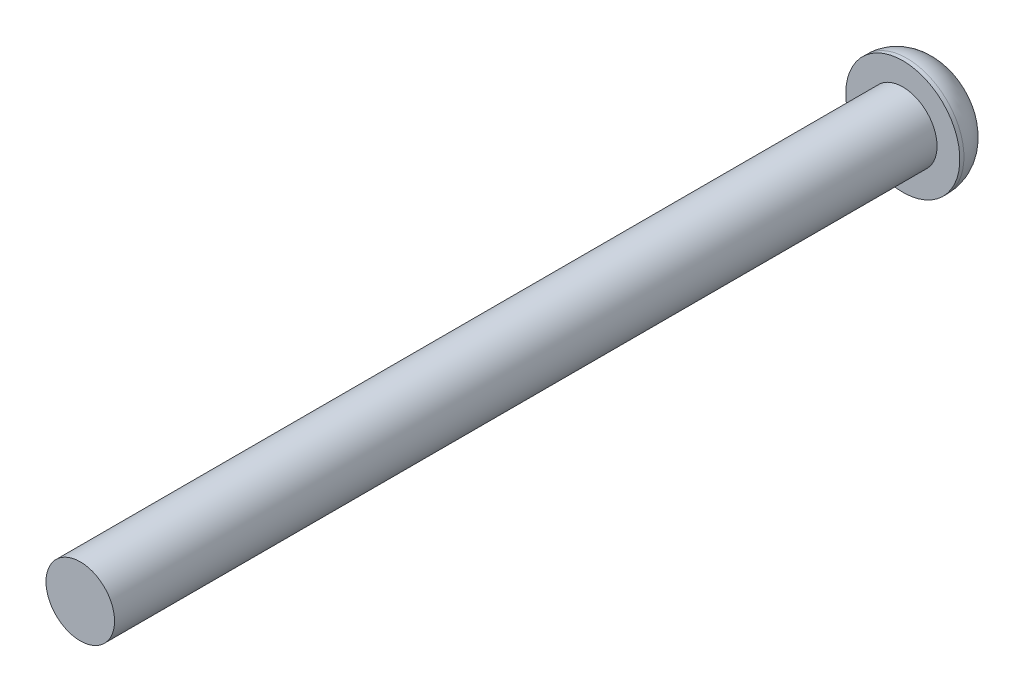
ISO-10303-21;
HEADER;
FILE_DESCRIPTION(('STEP AP214'),'2;1');
FILE_NAME('part.step','',(''),(''),'','','');
FILE_SCHEMA(('AUTOMOTIVE_DESIGN { 1 0 10303 214 1 1 1 1 }'));
ENDSEC;
DATA;
#1=APPLICATION_CONTEXT('core data for automotive mechanical design processes');
#2=APPLICATION_PROTOCOL_DEFINITION('international standard','automotive_design',2000,#1);
#3=PRODUCT_CONTEXT('',#1,'mechanical');
#4=PRODUCT('Part','Part','',(#3));
#5=PRODUCT_RELATED_PRODUCT_CATEGORY('part','',(#4));
#6=PRODUCT_DEFINITION_FORMATION('','',#4);
#7=PRODUCT_DEFINITION_CONTEXT('part definition',#1,'design');
#8=PRODUCT_DEFINITION('design','',#6,#7);
#9=PRODUCT_DEFINITION_SHAPE('','',#8);
#10=(LENGTH_UNIT() NAMED_UNIT(*) SI_UNIT(.MILLI.,.METRE.));
#11=(NAMED_UNIT(*) PLANE_ANGLE_UNIT() SI_UNIT($,.RADIAN.));
#12=(NAMED_UNIT(*) SI_UNIT($,.STERADIAN.) SOLID_ANGLE_UNIT());
#13=UNCERTAINTY_MEASURE_WITH_UNIT(LENGTH_MEASURE(1.E-05),#10,'distance_accuracy_value','');
#14=(GEOMETRIC_REPRESENTATION_CONTEXT(3) GLOBAL_UNCERTAINTY_ASSIGNED_CONTEXT((#13)) GLOBAL_UNIT_ASSIGNED_CONTEXT((#10,
#11,#12)) REPRESENTATION_CONTEXT('',''));
#15=CARTESIAN_POINT('',(0.,0.,0.));
#16=DIRECTION('',(0.,0.,1.));
#17=DIRECTION('',(1.,0.,0.));
#18=AXIS2_PLACEMENT_3D('',#15,#16,#17);
#19=CARTESIAN_POINT('',(0.,0.,60.));
#20=DIRECTION('',(0.,0.,-1.));
#21=DIRECTION('',(-1.,0.,0.));
#22=AXIS2_PLACEMENT_3D('',#19,#20,#21);
#23=CYLINDRICAL_SURFACE('',#22,2.5);
#24=CARTESIAN_POINT('',(0.,0.,60.));
#25=DIRECTION('',(0.,0.,1.));
#26=DIRECTION('',(1.,0.,0.));
#27=AXIS2_PLACEMENT_3D('',#24,#25,#26);
#28=CIRCLE('',#27,2.5);
#29=CARTESIAN_POINT('',(2.5,0.,60.));
#30=VERTEX_POINT('',#29);
#31=EDGE_CURVE('E146',#30,#30,#28,.T.);
#32=ORIENTED_EDGE('',*,*,#31,.F.);
#33=EDGE_LOOP('',(#32));
#34=FACE_BOUND('',#33,.T.);
#35=CARTESIAN_POINT('',(0.,0.,0.));
#36=DIRECTION('',(0.,0.,-1.));
#37=DIRECTION('',(-1.,0.,0.));
#38=AXIS2_PLACEMENT_3D('',#35,#36,#37);
#39=CIRCLE('',#38,2.5);
#40=CARTESIAN_POINT('',(-2.5,0.,0.));
#41=VERTEX_POINT('',#40);
#42=EDGE_CURVE('E143',#41,#41,#39,.T.);
#43=ORIENTED_EDGE('',*,*,#42,.F.);
#44=EDGE_LOOP('',(#43));
#45=FACE_BOUND('',#44,.T.);
#46=ADVANCED_FACE('F33',(#34,#45),#23,.T.);
#47=CARTESIAN_POINT('',(0.,0.,60.));
#48=DIRECTION('',(0.,0.,1.));
#49=DIRECTION('',(1.,0.,0.));
#50=AXIS2_PLACEMENT_3D('',#47,#48,#49);
#51=PLANE('',#50);
#52=ORIENTED_EDGE('',*,*,#31,.T.);
#53=EDGE_LOOP('',(#52));
#54=FACE_BOUND('',#53,.T.);
#55=ADVANCED_FACE('F167',(#54),#51,.T.);
#56=CARTESIAN_POINT('',(0.,0.,0.));
#57=DIRECTION('',(0.,0.,-1.));
#58=DIRECTION('',(-1.,0.,0.));
#59=AXIS2_PLACEMENT_3D('',#56,#57,#58);
#60=PLANE('',#59);
#61=CARTESIAN_POINT('',(0.,0.,0.));
#62=DIRECTION('',(0.,0.,-1.));
#63=DIRECTION('',(-1.,0.,0.));
#64=AXIS2_PLACEMENT_3D('',#61,#62,#63);
#65=CIRCLE('',#64,4.15958487677486);
#66=CARTESIAN_POINT('',(-4.15958487677486,0.,0.));
#67=VERTEX_POINT('',#66);
#68=EDGE_CURVE('E135',#67,#67,#65,.T.);
#69=ORIENTED_EDGE('',*,*,#68,.F.);
#70=EDGE_LOOP('',(#69));
#71=FACE_BOUND('',#70,.T.);
#72=ORIENTED_EDGE('',*,*,#42,.T.);
#73=EDGE_LOOP('',(#72));
#74=FACE_BOUND('',#73,.T.);
#75=ADVANCED_FACE('F172',(#71,#74),#60,.F.);
#76=CARTESIAN_POINT('',(0.,0.,-2.8));
#77=DIRECTION('',(0.,0.,1.));
#78=DIRECTION('',(1.,0.,0.));
#79=AXIS2_PLACEMENT_3D('',#76,#77,#78);
#80=CYLINDRICAL_SURFACE('',#79,4.15958487677486);
#81=CARTESIAN_POINT('',(0.,0.,-0.3));
#82=DIRECTION('',(0.,0.,-1.));
#83=DIRECTION('',(-1.,0.,0.));
#84=AXIS2_PLACEMENT_3D('',#81,#82,#83);
#85=CIRCLE('',#84,4.15958487677486);
#86=CARTESIAN_POINT('',(-4.15958487677486,0.,-0.3));
#87=VERTEX_POINT('',#86);
#88=EDGE_CURVE('E11',#87,#87,#85,.F.);
#89=ORIENTED_EDGE('',*,*,#88,.T.);
#90=EDGE_LOOP('',(#89));
#91=FACE_BOUND('',#90,.T.);
#92=ORIENTED_EDGE('',*,*,#68,.T.);
#93=EDGE_LOOP('',(#92));
#94=FACE_BOUND('',#93,.T.);
#95=ADVANCED_FACE('F162',(#91,#94),#80,.T.);
#96=CARTESIAN_POINT('',(0.,0.,-2.8));
#97=DIRECTION('',(0.,0.,-1.));
#98=DIRECTION('',(-1.,0.,0.));
#99=AXIS2_PLACEMENT_3D('',#96,#97,#98);
#100=PLANE('',#99);
#101=DIRECTION('',(-0.814788791019046,0.579757902947188,0.));
#102=VECTOR('',#101,1.);
#103=CARTESIAN_POINT('',(-0.144973678126217,-1.52414450415627,-2.8));
#104=LINE('',#103,#102);
#105=CARTESIAN_POINT('',(-0.144973678126217,-1.52414450415627,-2.8));
#106=VERTEX_POINT('',#105);
#107=CARTESIAN_POINT('',(-1.39243469870088,-0.636521363940765,-2.8));
#108=VERTEX_POINT('',#107);
#109=EDGE_CURVE('E48',#106,#108,#104,.T.);
#110=ORIENTED_EDGE('',*,*,#109,.F.);
#111=DIRECTION('',(-0.909479467506581,-0.415748840267711,0.));
#112=VECTOR('',#111,1.);
#113=CARTESIAN_POINT('',(1.24746102057466,-0.887623140215509,-2.8));
#114=LINE('',#113,#112);
#115=CARTESIAN_POINT('',(1.24746102057466,-0.887623140215509,-2.8));
#116=VERTEX_POINT('',#115);
#117=EDGE_CURVE('E131',#116,#106,#114,.T.);
#118=ORIENTED_EDGE('',*,*,#117,.F.);
#119=DIRECTION('',(-0.0946906764875342,-0.995506743214898,0.));
#120=VECTOR('',#119,1.);
#121=CARTESIAN_POINT('',(1.39243469870088,0.636521363940765,-2.8));
#122=LINE('',#121,#120);
#123=CARTESIAN_POINT('',(1.39243469870088,0.636521363940765,-2.8));
#124=VERTEX_POINT('',#123);
#125=EDGE_CURVE('E129',#124,#116,#122,.T.);
#126=ORIENTED_EDGE('',*,*,#125,.F.);
#127=DIRECTION('',(0.814788791019046,-0.579757902947188,0.));
#128=VECTOR('',#127,1.);
#129=CARTESIAN_POINT('',(0.144973678126217,1.52414450415627,-2.8));
#130=LINE('',#129,#128);
#131=CARTESIAN_POINT('',(0.144973678126217,1.52414450415627,-2.8));
#132=VERTEX_POINT('',#131);
#133=EDGE_CURVE('E96',#132,#124,#130,.T.);
#134=ORIENTED_EDGE('',*,*,#133,.F.);
#135=DIRECTION('',(0.909479467506581,0.41574884026771,0.));
#136=VECTOR('',#135,1.);
#137=CARTESIAN_POINT('',(-1.24746102057466,0.88762314021551,-2.8));
#138=LINE('',#137,#136);
#139=CARTESIAN_POINT('',(-1.24746102057466,0.88762314021551,-2.8));
#140=VERTEX_POINT('',#139);
#141=EDGE_CURVE('E125',#140,#132,#138,.T.);
#142=ORIENTED_EDGE('',*,*,#141,.F.);
#143=DIRECTION('',(0.0946906764875343,0.995506743214898,0.));
#144=VECTOR('',#143,1.);
#145=CARTESIAN_POINT('',(-1.39243469870088,-0.636521363940765,-2.8));
#146=LINE('',#145,#144);
#147=EDGE_CURVE('E122',#108,#140,#146,.T.);
#148=ORIENTED_EDGE('',*,*,#147,.F.);
#149=EDGE_LOOP('',(#110,#118,#126,#134,#142,#148));
#150=FACE_BOUND('',#149,.T.);
#151=CARTESIAN_POINT('',(0.,0.,-2.8));
#152=DIRECTION('',(0.,0.,-1.));
#153=DIRECTION('',(-1.,0.,0.));
#154=AXIS2_PLACEMENT_3D('',#151,#152,#153);
#155=CIRCLE('',#154,1.65958487677486);
#156=CARTESIAN_POINT('',(-1.65958487677486,0.,-2.8));
#157=VERTEX_POINT('',#156);
#158=EDGE_CURVE('E41',#157,#157,#155,.T.);
#159=ORIENTED_EDGE('',*,*,#158,.T.);
#160=EDGE_LOOP('',(#159));
#161=FACE_BOUND('',#160,.T.);
#162=ADVANCED_FACE('F151',(#150,#161),#100,.T.);
#163=CARTESIAN_POINT('',(0.,0.,-0.3));
#164=DIRECTION('',(0.,0.,-1.));
#165=DIRECTION('',(-1.,0.,0.));
#166=AXIS2_PLACEMENT_3D('',#163,#164,#165);
#167=DEGENERATE_TOROIDAL_SURFACE('',#166,1.65958487677486,2.5,.T.);
#168=ORIENTED_EDGE('',*,*,#88,.F.);
#169=EDGE_LOOP('',(#168));
#170=FACE_BOUND('',#169,.T.);
#171=ORIENTED_EDGE('',*,*,#158,.F.);
#172=EDGE_LOOP('',(#171));
#173=FACE_BOUND('',#172,.T.);
#174=ADVANCED_FACE('F35',(#170,#173),#167,.T.);
#175=CARTESIAN_POINT('',(-0.144973678126217,-1.52414450415627,-0.8));
#176=DIRECTION('',(-0.579757902947188,-0.814788791019046,0.));
#177=DIRECTION('',(0.814788791019046,-0.579757902947188,0.));
#178=AXIS2_PLACEMENT_3D('',#175,#176,#177);
#179=PLANE('',#178);
#180=ORIENTED_EDGE('',*,*,#109,.T.);
#181=DIRECTION('',(0.,0.,-1.));
#182=VECTOR('',#181,1.);
#183=CARTESIAN_POINT('',(-1.39243469870088,-0.636521363940765,-0.8));
#184=LINE('',#183,#182);
#185=CARTESIAN_POINT('',(-1.39243469870088,-0.636521363940765,-0.8));
#186=VERTEX_POINT('',#185);
#187=EDGE_CURVE('E78',#186,#108,#184,.T.);
#188=ORIENTED_EDGE('',*,*,#187,.F.);
#189=DIRECTION('',(-0.814788791019046,0.579757902947188,0.));
#190=VECTOR('',#189,1.);
#191=CARTESIAN_POINT('',(-0.144973678126217,-1.52414450415627,-0.8));
#192=LINE('',#191,#190);
#193=CARTESIAN_POINT('',(-0.144973678126217,-1.52414450415627,-0.8));
#194=VERTEX_POINT('',#193);
#195=EDGE_CURVE('E133',#194,#186,#192,.T.);
#196=ORIENTED_EDGE('',*,*,#195,.F.);
#197=DIRECTION('',(0.,0.,-1.));
#198=VECTOR('',#197,1.);
#199=CARTESIAN_POINT('',(-0.144973678126217,-1.52414450415627,-0.8));
#200=LINE('',#199,#198);
#201=EDGE_CURVE('E56',#194,#106,#200,.T.);
#202=ORIENTED_EDGE('',*,*,#201,.T.);
#203=EDGE_LOOP('',(#180,#188,#196,#202));
#204=FACE_BOUND('',#203,.T.);
#205=ADVANCED_FACE('F154',(#204),#179,.F.);
#206=CARTESIAN_POINT('',(1.24746102057466,-0.887623140215509,-0.8));
#207=DIRECTION('',(0.415748840267711,-0.909479467506581,0.));
#208=DIRECTION('',(0.909479467506581,0.415748840267711,0.));
#209=AXIS2_PLACEMENT_3D('',#206,#207,#208);
#210=PLANE('',#209);
#211=ORIENTED_EDGE('',*,*,#117,.T.);
#212=ORIENTED_EDGE('',*,*,#201,.F.);
#213=DIRECTION('',(-0.909479467506581,-0.415748840267711,0.));
#214=VECTOR('',#213,1.);
#215=CARTESIAN_POINT('',(1.24746102057466,-0.887623140215509,-0.8));
#216=LINE('',#215,#214);
#217=CARTESIAN_POINT('',(1.24746102057466,-0.887623140215509,-0.8));
#218=VERTEX_POINT('',#217);
#219=EDGE_CURVE('E108',#218,#194,#216,.T.);
#220=ORIENTED_EDGE('',*,*,#219,.F.);
#221=DIRECTION('',(0.,0.,-1.));
#222=VECTOR('',#221,1.);
#223=CARTESIAN_POINT('',(1.24746102057466,-0.887623140215509,-0.8));
#224=LINE('',#223,#222);
#225=EDGE_CURVE('E100',#218,#116,#224,.T.);
#226=ORIENTED_EDGE('',*,*,#225,.T.);
#227=EDGE_LOOP('',(#211,#212,#220,#226));
#228=FACE_BOUND('',#227,.T.);
#229=ADVANCED_FACE('F160',(#228),#210,.F.);
#230=CARTESIAN_POINT('',(1.39243469870088,0.636521363940765,-0.8));
#231=DIRECTION('',(0.995506743214898,-0.0946906764875343,0.));
#232=DIRECTION('',(0.0946906764875343,0.995506743214898,0.));
#233=AXIS2_PLACEMENT_3D('',#230,#231,#232);
#234=PLANE('',#233);
#235=ORIENTED_EDGE('',*,*,#125,.T.);
#236=ORIENTED_EDGE('',*,*,#225,.F.);
#237=DIRECTION('',(-0.0946906764875342,-0.995506743214898,0.));
#238=VECTOR('',#237,1.);
#239=CARTESIAN_POINT('',(1.39243469870088,0.636521363940765,-0.8));
#240=LINE('',#239,#238);
#241=CARTESIAN_POINT('',(1.39243469870088,0.636521363940765,-0.8));
#242=VERTEX_POINT('',#241);
#243=EDGE_CURVE('E104',#242,#218,#240,.T.);
#244=ORIENTED_EDGE('',*,*,#243,.F.);
#245=DIRECTION('',(0.,0.,-1.));
#246=VECTOR('',#245,1.);
#247=CARTESIAN_POINT('',(1.39243469870088,0.636521363940765,-0.8));
#248=LINE('',#247,#246);
#249=EDGE_CURVE('E89',#242,#124,#248,.T.);
#250=ORIENTED_EDGE('',*,*,#249,.T.);
#251=EDGE_LOOP('',(#235,#236,#244,#250));
#252=FACE_BOUND('',#251,.T.);
#253=ADVANCED_FACE('F105',(#252),#234,.F.);
#254=CARTESIAN_POINT('',(0.144973678126217,1.52414450415627,-0.8));
#255=DIRECTION('',(0.579757902947188,0.814788791019046,0.));
#256=DIRECTION('',(-0.814788791019047,0.579757902947188,0.));
#257=AXIS2_PLACEMENT_3D('',#254,#255,#256);
#258=PLANE('',#257);
#259=ORIENTED_EDGE('',*,*,#133,.T.);
#260=ORIENTED_EDGE('',*,*,#249,.F.);
#261=DIRECTION('',(0.814788791019046,-0.579757902947188,0.));
#262=VECTOR('',#261,1.);
#263=CARTESIAN_POINT('',(0.144973678126217,1.52414450415627,-0.8));
#264=LINE('',#263,#262);
#265=CARTESIAN_POINT('',(0.144973678126217,1.52414450415627,-0.8));
#266=VERTEX_POINT('',#265);
#267=EDGE_CURVE('E93',#266,#242,#264,.T.);
#268=ORIENTED_EDGE('',*,*,#267,.F.);
#269=DIRECTION('',(0.,0.,-1.));
#270=VECTOR('',#269,1.);
#271=CARTESIAN_POINT('',(0.144973678126217,1.52414450415627,-0.8));
#272=LINE('',#271,#270);
#273=EDGE_CURVE('E101',#266,#132,#272,.T.);
#274=ORIENTED_EDGE('',*,*,#273,.T.);
#275=EDGE_LOOP('',(#259,#260,#268,#274));
#276=FACE_BOUND('',#275,.T.);
#277=ADVANCED_FACE('F91',(#276),#258,.F.);
#278=CARTESIAN_POINT('',(-1.24746102057466,0.88762314021551,-0.8));
#279=DIRECTION('',(-0.41574884026771,0.909479467506581,0.));
#280=DIRECTION('',(-0.909479467506581,-0.41574884026771,0.));
#281=AXIS2_PLACEMENT_3D('',#278,#279,#280);
#282=PLANE('',#281);
#283=ORIENTED_EDGE('',*,*,#141,.T.);
#284=ORIENTED_EDGE('',*,*,#273,.F.);
#285=DIRECTION('',(0.909479467506581,0.41574884026771,0.));
#286=VECTOR('',#285,1.);
#287=CARTESIAN_POINT('',(-1.24746102057466,0.88762314021551,-0.8));
#288=LINE('',#287,#286);
#289=CARTESIAN_POINT('',(-1.24746102057466,0.88762314021551,-0.8));
#290=VERTEX_POINT('',#289);
#291=EDGE_CURVE('E114',#290,#266,#288,.T.);
#292=ORIENTED_EDGE('',*,*,#291,.F.);
#293=DIRECTION('',(0.,0.,-1.));
#294=VECTOR('',#293,1.);
#295=CARTESIAN_POINT('',(-1.24746102057466,0.88762314021551,-0.8));
#296=LINE('',#295,#294);
#297=EDGE_CURVE('E138',#290,#140,#296,.T.);
#298=ORIENTED_EDGE('',*,*,#297,.T.);
#299=EDGE_LOOP('',(#283,#284,#292,#298));
#300=FACE_BOUND('',#299,.T.);
#301=ADVANCED_FACE('F187',(#300),#282,.F.);
#302=CARTESIAN_POINT('',(-1.39243469870088,-0.636521363940765,-0.8));
#303=DIRECTION('',(-0.995506743214898,0.0946906764875343,0.));
#304=DIRECTION('',(-0.0946906764875343,-0.995506743214898,0.));
#305=AXIS2_PLACEMENT_3D('',#302,#303,#304);
#306=PLANE('',#305);
#307=ORIENTED_EDGE('',*,*,#147,.T.);
#308=ORIENTED_EDGE('',*,*,#297,.F.);
#309=DIRECTION('',(0.0946906764875343,0.995506743214898,0.));
#310=VECTOR('',#309,1.);
#311=CARTESIAN_POINT('',(-1.39243469870088,-0.636521363940765,-0.8));
#312=LINE('',#311,#310);
#313=EDGE_CURVE('E116',#186,#290,#312,.T.);
#314=ORIENTED_EDGE('',*,*,#313,.F.);
#315=ORIENTED_EDGE('',*,*,#187,.T.);
#316=EDGE_LOOP('',(#307,#308,#314,#315));
#317=FACE_BOUND('',#316,.T.);
#318=ADVANCED_FACE('F184',(#317),#306,.F.);
#319=CARTESIAN_POINT('',(0.,0.,-0.8));
#320=DIRECTION('',(0.,0.,-1.));
#321=DIRECTION('',(-1.,0.,0.));
#322=AXIS2_PLACEMENT_3D('',#319,#320,#321);
#323=PLANE('',#322);
#324=ORIENTED_EDGE('',*,*,#195,.T.);
#325=ORIENTED_EDGE('',*,*,#313,.T.);
#326=ORIENTED_EDGE('',*,*,#291,.T.);
#327=ORIENTED_EDGE('',*,*,#267,.T.);
#328=ORIENTED_EDGE('',*,*,#243,.T.);
#329=ORIENTED_EDGE('',*,*,#219,.T.);
#330=EDGE_LOOP('',(#324,#325,#326,#327,#328,#329));
#331=FACE_BOUND('',#330,.T.);
#332=ADVANCED_FACE('F111',(#331),#323,.T.);
#333=CLOSED_SHELL('',(#46,#55,#75,#95,#162,#174,#205,#229,#253,#277,#301,#318,#332));
#334=MANIFOLD_SOLID_BREP('B2',#333);
#335=ADVANCED_BREP_SHAPE_REPRESENTATION('',(#18,#334),#14);
#336=SHAPE_DEFINITION_REPRESENTATION(#9,#335);
ENDSEC;
END-ISO-10303-21;
